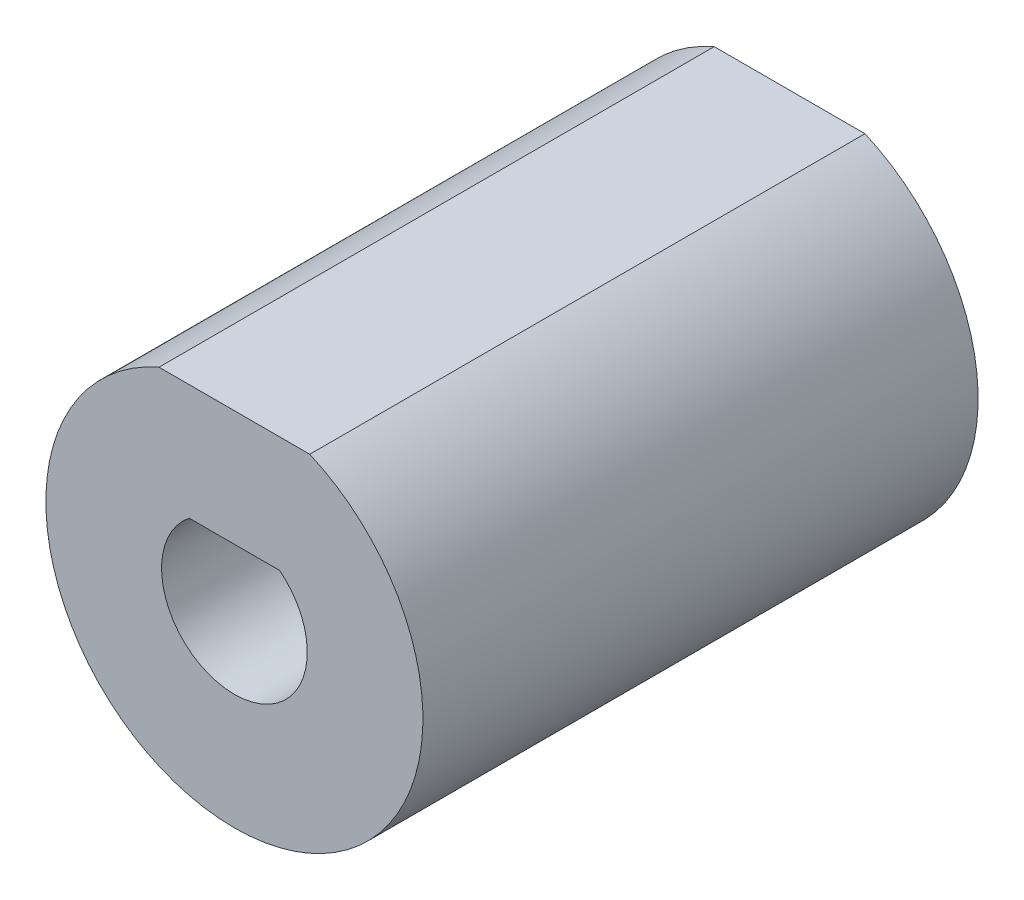
ISO-10303-21;
HEADER;
FILE_DESCRIPTION(('STEP AP214'),'2;1');
FILE_NAME('part.step','',(''),(''),'','','');
FILE_SCHEMA(('AUTOMOTIVE_DESIGN { 1 0 10303 214 1 1 1 1 }'));
ENDSEC;
DATA;
#1=APPLICATION_CONTEXT('core data for automotive mechanical design processes');
#2=APPLICATION_PROTOCOL_DEFINITION('international standard','automotive_design',2000,#1);
#3=PRODUCT_CONTEXT('',#1,'mechanical');
#4=PRODUCT('Part','Part','',(#3));
#5=PRODUCT_RELATED_PRODUCT_CATEGORY('part','',(#4));
#6=PRODUCT_DEFINITION_FORMATION('','',#4);
#7=PRODUCT_DEFINITION_CONTEXT('part definition',#1,'design');
#8=PRODUCT_DEFINITION('design','',#6,#7);
#9=PRODUCT_DEFINITION_SHAPE('','',#8);
#10=(LENGTH_UNIT() NAMED_UNIT(*) SI_UNIT(.MILLI.,.METRE.));
#11=(NAMED_UNIT(*) PLANE_ANGLE_UNIT() SI_UNIT($,.RADIAN.));
#12=(NAMED_UNIT(*) SI_UNIT($,.STERADIAN.) SOLID_ANGLE_UNIT());
#13=UNCERTAINTY_MEASURE_WITH_UNIT(LENGTH_MEASURE(1.E-05),#10,'distance_accuracy_value','');
#14=(GEOMETRIC_REPRESENTATION_CONTEXT(3) GLOBAL_UNCERTAINTY_ASSIGNED_CONTEXT((#13)) GLOBAL_UNIT_ASSIGNED_CONTEXT((#10,
#11,#12)) REPRESENTATION_CONTEXT('',''));
#15=CARTESIAN_POINT('',(0.,0.,0.));
#16=DIRECTION('',(0.,0.,1.));
#17=DIRECTION('',(1.,0.,0.));
#18=AXIS2_PLACEMENT_3D('',#15,#16,#17);
#19=CARTESIAN_POINT('',(0.,0.,6.35));
#20=DIRECTION('',(0.,0.,1.));
#21=DIRECTION('',(1.,0.,0.));
#22=AXIS2_PLACEMENT_3D('',#19,#20,#21);
#23=PLANE('',#22);
#24=CARTESIAN_POINT('',(0.,0.,6.35));
#25=DIRECTION('',(0.,0.,1.));
#26=DIRECTION('',(1.,0.,0.));
#27=AXIS2_PLACEMENT_3D('',#24,#25,#26);
#28=CIRCLE('',#27,5.175);
#29=CARTESIAN_POINT('',(-2.06946310567277,4.743200128,6.35));
#30=VERTEX_POINT('',#29);
#31=CARTESIAN_POINT('',(2.06946310567277,4.743200128,6.35));
#32=VERTEX_POINT('',#31);
#33=EDGE_CURVE('E79',#30,#32,#28,.T.);
#34=ORIENTED_EDGE('',*,*,#33,.T.);
#35=DIRECTION('',(-1.,0.,0.));
#36=VECTOR('',#35,1.);
#37=CARTESIAN_POINT('',(-2.06946310567277,4.743200128,6.35));
#38=LINE('',#37,#36);
#39=EDGE_CURVE('E55',#32,#30,#38,.T.);
#40=ORIENTED_EDGE('',*,*,#39,.T.);
#41=EDGE_LOOP('',(#34,#40));
#42=FACE_BOUND('',#41,.T.);
#43=DIRECTION('',(-1.,0.,0.));
#44=VECTOR('',#43,1.);
#45=CARTESIAN_POINT('',(-1.24126885022576,1.568200128,6.35));
#46=LINE('',#45,#44);
#47=CARTESIAN_POINT('',(1.24126885022576,1.568200128,6.35));
#48=VERTEX_POINT('',#47);
#49=CARTESIAN_POINT('',(-1.24126885022576,1.568200128,6.35));
#50=VERTEX_POINT('',#49);
#51=EDGE_CURVE('E97',#48,#50,#46,.T.);
#52=ORIENTED_EDGE('',*,*,#51,.F.);
#53=CARTESIAN_POINT('',(0.,0.,6.35));
#54=DIRECTION('',(0.,0.,1.));
#55=DIRECTION('',(1.,0.,0.));
#56=AXIS2_PLACEMENT_3D('',#53,#54,#55);
#57=CIRCLE('',#56,2.);
#58=EDGE_CURVE('E95',#50,#48,#57,.T.);
#59=ORIENTED_EDGE('',*,*,#58,.F.);
#60=EDGE_LOOP('',(#52,#59));
#61=FACE_BOUND('',#60,.T.);
#62=ADVANCED_FACE('F33',(#42,#61),#23,.T.);
#63=CARTESIAN_POINT('',(0.,0.,6.35));
#64=DIRECTION('',(0.,0.,-1.));
#65=DIRECTION('',(-1.,0.,0.));
#66=AXIS2_PLACEMENT_3D('',#63,#64,#65);
#67=CYLINDRICAL_SURFACE('',#66,5.175);
#68=DIRECTION('',(0.,0.,-1.));
#69=VECTOR('',#68,1.);
#70=CARTESIAN_POINT('',(-2.06946310567277,4.743200128,6.35));
#71=LINE('',#70,#69);
#72=CARTESIAN_POINT('',(-2.06946310567277,4.743200128,-8.89));
#73=VERTEX_POINT('',#72);
#74=EDGE_CURVE('E74',#30,#73,#71,.T.);
#75=ORIENTED_EDGE('',*,*,#74,.T.);
#76=CARTESIAN_POINT('',(0.,0.,-8.89));
#77=DIRECTION('',(0.,0.,-1.));
#78=DIRECTION('',(-1.,0.,0.));
#79=AXIS2_PLACEMENT_3D('',#76,#77,#78);
#80=CIRCLE('',#79,5.175);
#81=CARTESIAN_POINT('',(2.06946310567277,4.743200128,-8.89));
#82=VERTEX_POINT('',#81);
#83=EDGE_CURVE('E78',#82,#73,#80,.T.);
#84=ORIENTED_EDGE('',*,*,#83,.F.);
#85=DIRECTION('',(0.,0.,-1.));
#86=VECTOR('',#85,1.);
#87=CARTESIAN_POINT('',(2.06946310567277,4.743200128,6.35));
#88=LINE('',#87,#86);
#89=EDGE_CURVE('E41',#32,#82,#88,.T.);
#90=ORIENTED_EDGE('',*,*,#89,.F.);
#91=ORIENTED_EDGE('',*,*,#33,.F.);
#92=EDGE_LOOP('',(#75,#84,#90,#91));
#93=FACE_BOUND('',#92,.T.);
#94=ADVANCED_FACE('F35',(#93),#67,.T.);
#95=CARTESIAN_POINT('',(-2.06946310567277,4.743200128,6.35));
#96=DIRECTION('',(0.,-1.,0.));
#97=DIRECTION('',(0.,0.,-1.));
#98=AXIS2_PLACEMENT_3D('',#95,#96,#97);
#99=PLANE('',#98);
#100=ORIENTED_EDGE('',*,*,#89,.T.);
#101=DIRECTION('',(1.,0.,0.));
#102=VECTOR('',#101,1.);
#103=CARTESIAN_POINT('',(-2.06946310567277,4.743200128,-8.89));
#104=LINE('',#103,#102);
#105=EDGE_CURVE('E83',#73,#82,#104,.T.);
#106=ORIENTED_EDGE('',*,*,#105,.F.);
#107=ORIENTED_EDGE('',*,*,#74,.F.);
#108=ORIENTED_EDGE('',*,*,#39,.F.);
#109=EDGE_LOOP('',(#100,#106,#107,#108));
#110=FACE_BOUND('',#109,.T.);
#111=ADVANCED_FACE('F84',(#110),#99,.F.);
#112=CARTESIAN_POINT('',(0.,0.,6.35));
#113=DIRECTION('',(0.,0.,-1.));
#114=DIRECTION('',(-1.,0.,0.));
#115=AXIS2_PLACEMENT_3D('',#112,#113,#114);
#116=CYLINDRICAL_SURFACE('',#115,2.);
#117=CARTESIAN_POINT('',(0.,0.,0.));
#118=DIRECTION('',(0.,0.,1.));
#119=DIRECTION('',(1.,0.,0.));
#120=AXIS2_PLACEMENT_3D('',#117,#118,#119);
#121=CIRCLE('',#120,2.);
#122=CARTESIAN_POINT('',(-1.24126885022576,1.568200128,0.));
#123=VERTEX_POINT('',#122);
#124=CARTESIAN_POINT('',(1.24126885022576,1.568200128,0.));
#125=VERTEX_POINT('',#124);
#126=EDGE_CURVE('E86',#123,#125,#121,.T.);
#127=ORIENTED_EDGE('',*,*,#126,.F.);
#128=DIRECTION('',(0.,0.,-1.));
#129=VECTOR('',#128,1.);
#130=CARTESIAN_POINT('',(-1.24126885022576,1.568200128,6.35));
#131=LINE('',#130,#129);
#132=EDGE_CURVE('E100',#50,#123,#131,.T.);
#133=ORIENTED_EDGE('',*,*,#132,.F.);
#134=ORIENTED_EDGE('',*,*,#58,.T.);
#135=DIRECTION('',(0.,0.,-1.));
#136=VECTOR('',#135,1.);
#137=CARTESIAN_POINT('',(1.24126885022576,1.568200128,6.35));
#138=LINE('',#137,#136);
#139=EDGE_CURVE('E48',#48,#125,#138,.T.);
#140=ORIENTED_EDGE('',*,*,#139,.T.);
#141=EDGE_LOOP('',(#127,#133,#134,#140));
#142=FACE_BOUND('',#141,.T.);
#143=ADVANCED_FACE('F117',(#142),#116,.F.);
#144=CARTESIAN_POINT('',(-1.24126885022576,1.568200128,6.35));
#145=DIRECTION('',(0.,-1.,0.));
#146=DIRECTION('',(0.,0.,-1.));
#147=AXIS2_PLACEMENT_3D('',#144,#145,#146);
#148=PLANE('',#147);
#149=DIRECTION('',(-1.,0.,0.));
#150=VECTOR('',#149,1.);
#151=CARTESIAN_POINT('',(-1.24126885022576,1.568200128,0.));
#152=LINE('',#151,#150);
#153=EDGE_CURVE('E98',#125,#123,#152,.T.);
#154=ORIENTED_EDGE('',*,*,#153,.F.);
#155=ORIENTED_EDGE('',*,*,#139,.F.);
#156=ORIENTED_EDGE('',*,*,#51,.T.);
#157=ORIENTED_EDGE('',*,*,#132,.T.);
#158=EDGE_LOOP('',(#154,#155,#156,#157));
#159=FACE_BOUND('',#158,.T.);
#160=ADVANCED_FACE('F114',(#159),#148,.T.);
#161=CARTESIAN_POINT('',(0.,0.,0.));
#162=DIRECTION('',(0.,0.,-1.));
#163=DIRECTION('',(-1.,0.,0.));
#164=AXIS2_PLACEMENT_3D('',#161,#162,#163);
#165=PLANE('',#164);
#166=ORIENTED_EDGE('',*,*,#153,.T.);
#167=ORIENTED_EDGE('',*,*,#126,.T.);
#168=EDGE_LOOP('',(#166,#167));
#169=FACE_BOUND('',#168,.T.);
#170=ADVANCED_FACE('F119',(#169),#165,.F.);
#171=CARTESIAN_POINT('',(0.,0.,-8.89));
#172=DIRECTION('',(0.,0.,-1.));
#173=DIRECTION('',(-1.,0.,0.));
#174=AXIS2_PLACEMENT_3D('',#171,#172,#173);
#175=PLANE('',#174);
#176=ORIENTED_EDGE('',*,*,#83,.T.);
#177=ORIENTED_EDGE('',*,*,#105,.T.);
#178=EDGE_LOOP('',(#176,#177));
#179=FACE_BOUND('',#178,.T.);
#180=CARTESIAN_POINT('',(0.,0.,-8.89));
#181=DIRECTION('',(0.,0.,-1.));
#182=DIRECTION('',(-1.,0.,0.));
#183=AXIS2_PLACEMENT_3D('',#180,#181,#182);
#184=CIRCLE('',#183,1.5113);
#185=CARTESIAN_POINT('',(-1.5113,0.,-8.89));
#186=VERTEX_POINT('',#185);
#187=EDGE_CURVE('E90',#186,#186,#184,.T.);
#188=ORIENTED_EDGE('',*,*,#187,.F.);
#189=EDGE_LOOP('',(#188));
#190=FACE_BOUND('',#189,.T.);
#191=ADVANCED_FACE('F88',(#179,#190),#175,.T.);
#192=CARTESIAN_POINT('',(0.,0.,-8.89));
#193=DIRECTION('',(0.,0.,1.));
#194=DIRECTION('',(1.,0.,0.));
#195=AXIS2_PLACEMENT_3D('',#192,#193,#194);
#196=CYLINDRICAL_SURFACE('',#195,1.5113);
#197=ORIENTED_EDGE('',*,*,#187,.T.);
#198=EDGE_LOOP('',(#197));
#199=FACE_BOUND('',#198,.T.);
#200=CARTESIAN_POINT('',(0.,0.,-2.54));
#201=DIRECTION('',(0.,0.,-1.));
#202=DIRECTION('',(-1.,0.,0.));
#203=AXIS2_PLACEMENT_3D('',#200,#201,#202);
#204=CIRCLE('',#203,1.5113);
#205=CARTESIAN_POINT('',(-1.5113,0.,-2.54));
#206=VERTEX_POINT('',#205);
#207=EDGE_CURVE('E11',#206,#206,#204,.F.);
#208=ORIENTED_EDGE('',*,*,#207,.T.);
#209=EDGE_LOOP('',(#208));
#210=FACE_BOUND('',#209,.T.);
#211=ADVANCED_FACE('F126',(#199,#210),#196,.F.);
#212=CARTESIAN_POINT('',(0.,0.,-2.54));
#213=DIRECTION('',(0.,0.,-1.));
#214=DIRECTION('',(-1.,0.,0.));
#215=AXIS2_PLACEMENT_3D('',#212,#213,#214);
#216=PLANE('',#215);
#217=ORIENTED_EDGE('',*,*,#207,.F.);
#218=EDGE_LOOP('',(#217));
#219=FACE_BOUND('',#218,.T.);
#220=ADVANCED_FACE('F130',(#219),#216,.T.);
#221=CLOSED_SHELL('',(#62,#94,#111,#143,#160,#170,#191,#211,#220));
#222=MANIFOLD_SOLID_BREP('B2',#221);
#223=ADVANCED_BREP_SHAPE_REPRESENTATION('',(#18,#222),#14);
#224=SHAPE_DEFINITION_REPRESENTATION(#9,#223);
ENDSEC;
END-ISO-10303-21;
